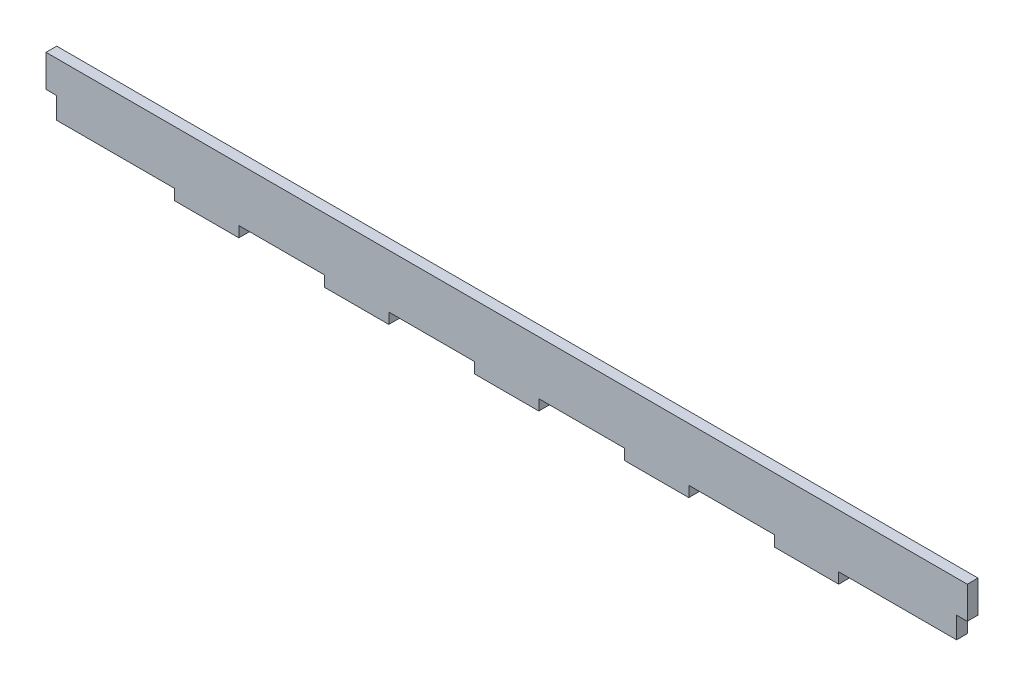
ISO-10303-21;
HEADER;
FILE_DESCRIPTION(('STEP AP214'),'2;1');
FILE_NAME('part.step','',(''),(''),'','','');
FILE_SCHEMA(('AUTOMOTIVE_DESIGN { 1 0 10303 214 1 1 1 1 }'));
ENDSEC;
DATA;
#1=APPLICATION_CONTEXT('core data for automotive mechanical design processes');
#2=APPLICATION_PROTOCOL_DEFINITION('international standard','automotive_design',2000,#1);
#3=PRODUCT_CONTEXT('',#1,'mechanical');
#4=PRODUCT('Part','Part','',(#3));
#5=PRODUCT_RELATED_PRODUCT_CATEGORY('part','',(#4));
#6=PRODUCT_DEFINITION_FORMATION('','',#4);
#7=PRODUCT_DEFINITION_CONTEXT('part definition',#1,'design');
#8=PRODUCT_DEFINITION('design','',#6,#7);
#9=PRODUCT_DEFINITION_SHAPE('','',#8);
#10=(LENGTH_UNIT() NAMED_UNIT(*) SI_UNIT(.MILLI.,.METRE.));
#11=(NAMED_UNIT(*) PLANE_ANGLE_UNIT() SI_UNIT($,.RADIAN.));
#12=(NAMED_UNIT(*) SI_UNIT($,.STERADIAN.) SOLID_ANGLE_UNIT());
#13=UNCERTAINTY_MEASURE_WITH_UNIT(LENGTH_MEASURE(1.E-05),#10,'distance_accuracy_value','');
#14=(GEOMETRIC_REPRESENTATION_CONTEXT(3) GLOBAL_UNCERTAINTY_ASSIGNED_CONTEXT((#13)) GLOBAL_UNIT_ASSIGNED_CONTEXT((#10,
#11,#12)) REPRESENTATION_CONTEXT('',''));
#15=CARTESIAN_POINT('',(0.,0.,0.));
#16=DIRECTION('',(0.,0.,1.));
#17=DIRECTION('',(1.,0.,0.));
#18=AXIS2_PLACEMENT_3D('',#15,#16,#17);
#19=CARTESIAN_POINT('',(-169.999999999999,-430.000000000006,5.));
#20=DIRECTION('',(0.,1.,0.));
#21=DIRECTION('',(-1.,0.,0.));
#22=AXIS2_PLACEMENT_3D('',#19,#20,#21);
#23=PLANE('',#22);
#24=DIRECTION('',(1.,0.,0.));
#25=VECTOR('',#24,1.);
#26=CARTESIAN_POINT('',(-169.999999999999,-430.000000000006,0.));
#27=LINE('',#26,#25);
#28=CARTESIAN_POINT('',(-209.999999999999,-430.000000000006,0.));
#29=VERTEX_POINT('',#28);
#30=CARTESIAN_POINT('',(-169.999999999999,-430.000000000006,0.));
#31=VERTEX_POINT('',#30);
#32=EDGE_CURVE('E264',#29,#31,#27,.T.);
#33=ORIENTED_EDGE('',*,*,#32,.T.);
#34=DIRECTION('',(0.,0.,-1.));
#35=VECTOR('',#34,1.);
#36=CARTESIAN_POINT('',(-169.999999999999,-430.000000000006,5.));
#37=LINE('',#36,#35);
#38=CARTESIAN_POINT('',(-169.999999999999,-430.000000000006,5.));
#39=VERTEX_POINT('',#38);
#40=EDGE_CURVE('E11',#39,#31,#37,.T.);
#41=ORIENTED_EDGE('',*,*,#40,.F.);
#42=DIRECTION('',(1.,0.,0.));
#43=VECTOR('',#42,1.);
#44=CARTESIAN_POINT('',(-169.999999999999,-430.000000000006,5.));
#45=LINE('',#44,#43);
#46=CARTESIAN_POINT('',(-209.999999999999,-430.000000000006,5.));
#47=VERTEX_POINT('',#46);
#48=EDGE_CURVE('E346',#47,#39,#45,.T.);
#49=ORIENTED_EDGE('',*,*,#48,.F.);
#50=DIRECTION('',(0.,0.,-1.));
#51=VECTOR('',#50,1.);
#52=CARTESIAN_POINT('',(-209.999999999999,-430.000000000006,5.));
#53=LINE('',#52,#51);
#54=EDGE_CURVE('E260',#47,#29,#53,.T.);
#55=ORIENTED_EDGE('',*,*,#54,.T.);
#56=EDGE_LOOP('',(#33,#41,#49,#55));
#57=FACE_BOUND('',#56,.T.);
#58=ADVANCED_FACE('F43',(#57),#23,.F.);
#59=CARTESIAN_POINT('',(-169.999999999999,-435.,5.));
#60=DIRECTION('',(1.,0.,0.));
#61=DIRECTION('',(0.,0.,-1.));
#62=AXIS2_PLACEMENT_3D('',#59,#60,#61);
#63=PLANE('',#62);
#64=DIRECTION('',(0.,-1.,0.));
#65=VECTOR('',#64,1.);
#66=CARTESIAN_POINT('',(-169.999999999999,-435.,0.));
#67=LINE('',#66,#65);
#68=CARTESIAN_POINT('',(-169.999999999999,-435.,0.));
#69=VERTEX_POINT('',#68);
#70=EDGE_CURVE('E268',#31,#69,#67,.T.);
#71=ORIENTED_EDGE('',*,*,#70,.T.);
#72=DIRECTION('',(0.,0.,-1.));
#73=VECTOR('',#72,1.);
#74=CARTESIAN_POINT('',(-169.999999999999,-435.,5.));
#75=LINE('',#74,#73);
#76=CARTESIAN_POINT('',(-169.999999999999,-435.,5.));
#77=VERTEX_POINT('',#76);
#78=EDGE_CURVE('E52',#77,#69,#75,.T.);
#79=ORIENTED_EDGE('',*,*,#78,.F.);
#80=DIRECTION('',(0.,-1.,0.));
#81=VECTOR('',#80,1.);
#82=CARTESIAN_POINT('',(-169.999999999999,-435.,5.));
#83=LINE('',#82,#81);
#84=EDGE_CURVE('E163',#39,#77,#83,.T.);
#85=ORIENTED_EDGE('',*,*,#84,.F.);
#86=ORIENTED_EDGE('',*,*,#40,.T.);
#87=EDGE_LOOP('',(#71,#79,#85,#86));
#88=FACE_BOUND('',#87,.T.);
#89=ADVANCED_FACE('F552',(#88),#63,.F.);
#90=CARTESIAN_POINT('',(-139.999999999999,-435.,5.));
#91=DIRECTION('',(0.,1.,0.));
#92=DIRECTION('',(-1.,0.,0.));
#93=AXIS2_PLACEMENT_3D('',#90,#91,#92);
#94=PLANE('',#93);
#95=DIRECTION('',(1.,0.,0.));
#96=VECTOR('',#95,1.);
#97=CARTESIAN_POINT('',(-139.999999999999,-435.,0.));
#98=LINE('',#97,#96);
#99=CARTESIAN_POINT('',(-139.999999999999,-435.,0.));
#100=VERTEX_POINT('',#99);
#101=EDGE_CURVE('E271',#69,#100,#98,.T.);
#102=ORIENTED_EDGE('',*,*,#101,.T.);
#103=DIRECTION('',(0.,0.,-1.));
#104=VECTOR('',#103,1.);
#105=CARTESIAN_POINT('',(-139.999999999999,-435.,5.));
#106=LINE('',#105,#104);
#107=CARTESIAN_POINT('',(-139.999999999999,-435.,5.));
#108=VERTEX_POINT('',#107);
#109=EDGE_CURVE('E437',#108,#100,#106,.T.);
#110=ORIENTED_EDGE('',*,*,#109,.F.);
#111=DIRECTION('',(1.,0.,0.));
#112=VECTOR('',#111,1.);
#113=CARTESIAN_POINT('',(-139.999999999999,-435.,5.));
#114=LINE('',#113,#112);
#115=EDGE_CURVE('E447',#77,#108,#114,.T.);
#116=ORIENTED_EDGE('',*,*,#115,.F.);
#117=ORIENTED_EDGE('',*,*,#78,.T.);
#118=EDGE_LOOP('',(#102,#110,#116,#117));
#119=FACE_BOUND('',#118,.T.);
#120=ADVANCED_FACE('F445',(#119),#94,.F.);
#121=CARTESIAN_POINT('',(-139.999999999999,-430.000000000006,5.));
#122=DIRECTION('',(-1.,0.,0.));
#123=DIRECTION('',(0.,0.,1.));
#124=AXIS2_PLACEMENT_3D('',#121,#122,#123);
#125=PLANE('',#124);
#126=DIRECTION('',(0.,1.,0.));
#127=VECTOR('',#126,1.);
#128=CARTESIAN_POINT('',(-139.999999999999,-430.000000000006,0.));
#129=LINE('',#128,#127);
#130=CARTESIAN_POINT('',(-139.999999999999,-430.000000000006,0.));
#131=VERTEX_POINT('',#130);
#132=EDGE_CURVE('E274',#100,#131,#129,.T.);
#133=ORIENTED_EDGE('',*,*,#132,.T.);
#134=DIRECTION('',(0.,0.,-1.));
#135=VECTOR('',#134,1.);
#136=CARTESIAN_POINT('',(-139.999999999999,-430.000000000006,5.));
#137=LINE('',#136,#135);
#138=CARTESIAN_POINT('',(-139.999999999999,-430.000000000006,5.));
#139=VERTEX_POINT('',#138);
#140=EDGE_CURVE('E433',#139,#131,#137,.T.);
#141=ORIENTED_EDGE('',*,*,#140,.F.);
#142=DIRECTION('',(0.,1.,0.));
#143=VECTOR('',#142,1.);
#144=CARTESIAN_POINT('',(-139.999999999999,-430.000000000006,5.));
#145=LINE('',#144,#143);
#146=EDGE_CURVE('E466',#108,#139,#145,.T.);
#147=ORIENTED_EDGE('',*,*,#146,.F.);
#148=ORIENTED_EDGE('',*,*,#109,.T.);
#149=EDGE_LOOP('',(#133,#141,#147,#148));
#150=FACE_BOUND('',#149,.T.);
#151=ADVANCED_FACE('F456',(#150),#125,.F.);
#152=CARTESIAN_POINT('',(-99.9999999999994,-430.000000000006,5.));
#153=DIRECTION('',(0.,1.,0.));
#154=DIRECTION('',(-1.,0.,0.));
#155=AXIS2_PLACEMENT_3D('',#152,#153,#154);
#156=PLANE('',#155);
#157=DIRECTION('',(1.,0.,0.));
#158=VECTOR('',#157,1.);
#159=CARTESIAN_POINT('',(-99.9999999999994,-430.000000000006,0.));
#160=LINE('',#159,#158);
#161=CARTESIAN_POINT('',(-99.9999999999994,-430.000000000006,0.));
#162=VERTEX_POINT('',#161);
#163=EDGE_CURVE('E277',#131,#162,#160,.T.);
#164=ORIENTED_EDGE('',*,*,#163,.T.);
#165=DIRECTION('',(0.,0.,-1.));
#166=VECTOR('',#165,1.);
#167=CARTESIAN_POINT('',(-99.9999999999994,-430.000000000006,5.));
#168=LINE('',#167,#166);
#169=CARTESIAN_POINT('',(-99.9999999999994,-430.000000000006,5.));
#170=VERTEX_POINT('',#169);
#171=EDGE_CURVE('E429',#170,#162,#168,.T.);
#172=ORIENTED_EDGE('',*,*,#171,.F.);
#173=DIRECTION('',(1.,0.,0.));
#174=VECTOR('',#173,1.);
#175=CARTESIAN_POINT('',(-99.9999999999994,-430.000000000006,5.));
#176=LINE('',#175,#174);
#177=EDGE_CURVE('E462',#139,#170,#176,.T.);
#178=ORIENTED_EDGE('',*,*,#177,.F.);
#179=ORIENTED_EDGE('',*,*,#140,.T.);
#180=EDGE_LOOP('',(#164,#172,#178,#179));
#181=FACE_BOUND('',#180,.T.);
#182=ADVANCED_FACE('F460',(#181),#156,.F.);
#183=CARTESIAN_POINT('',(-99.9999999999994,-435.,5.));
#184=DIRECTION('',(1.,0.,0.));
#185=DIRECTION('',(0.,0.,-1.));
#186=AXIS2_PLACEMENT_3D('',#183,#184,#185);
#187=PLANE('',#186);
#188=DIRECTION('',(0.,-1.,0.));
#189=VECTOR('',#188,1.);
#190=CARTESIAN_POINT('',(-99.9999999999994,-435.,0.));
#191=LINE('',#190,#189);
#192=CARTESIAN_POINT('',(-99.9999999999994,-435.,0.));
#193=VERTEX_POINT('',#192);
#194=EDGE_CURVE('E280',#162,#193,#191,.T.);
#195=ORIENTED_EDGE('',*,*,#194,.T.);
#196=DIRECTION('',(0.,0.,-1.));
#197=VECTOR('',#196,1.);
#198=CARTESIAN_POINT('',(-99.9999999999994,-435.,5.));
#199=LINE('',#198,#197);
#200=CARTESIAN_POINT('',(-99.9999999999994,-435.,5.));
#201=VERTEX_POINT('',#200);
#202=EDGE_CURVE('E425',#201,#193,#199,.T.);
#203=ORIENTED_EDGE('',*,*,#202,.F.);
#204=DIRECTION('',(0.,-1.,0.));
#205=VECTOR('',#204,1.);
#206=CARTESIAN_POINT('',(-99.9999999999994,-435.,5.));
#207=LINE('',#206,#205);
#208=EDGE_CURVE('E465',#170,#201,#207,.T.);
#209=ORIENTED_EDGE('',*,*,#208,.F.);
#210=ORIENTED_EDGE('',*,*,#171,.T.);
#211=EDGE_LOOP('',(#195,#203,#209,#210));
#212=FACE_BOUND('',#211,.T.);
#213=ADVANCED_FACE('F565',(#212),#187,.F.);
#214=CARTESIAN_POINT('',(-69.9999999999994,-435.,5.));
#215=DIRECTION('',(0.,1.,0.));
#216=DIRECTION('',(-1.,0.,0.));
#217=AXIS2_PLACEMENT_3D('',#214,#215,#216);
#218=PLANE('',#217);
#219=DIRECTION('',(1.,0.,0.));
#220=VECTOR('',#219,1.);
#221=CARTESIAN_POINT('',(-69.9999999999994,-435.,0.));
#222=LINE('',#221,#220);
#223=CARTESIAN_POINT('',(-69.9999999999994,-435.,0.));
#224=VERTEX_POINT('',#223);
#225=EDGE_CURVE('E283',#193,#224,#222,.T.);
#226=ORIENTED_EDGE('',*,*,#225,.T.);
#227=DIRECTION('',(0.,0.,-1.));
#228=VECTOR('',#227,1.);
#229=CARTESIAN_POINT('',(-69.9999999999994,-435.,5.));
#230=LINE('',#229,#228);
#231=CARTESIAN_POINT('',(-69.9999999999994,-435.,5.));
#232=VERTEX_POINT('',#231);
#233=EDGE_CURVE('E421',#232,#224,#230,.T.);
#234=ORIENTED_EDGE('',*,*,#233,.F.);
#235=DIRECTION('',(1.,0.,0.));
#236=VECTOR('',#235,1.);
#237=CARTESIAN_POINT('',(-69.9999999999994,-435.,5.));
#238=LINE('',#237,#236);
#239=EDGE_CURVE('E470',#201,#232,#238,.T.);
#240=ORIENTED_EDGE('',*,*,#239,.F.);
#241=ORIENTED_EDGE('',*,*,#202,.T.);
#242=EDGE_LOOP('',(#226,#234,#240,#241));
#243=FACE_BOUND('',#242,.T.);
#244=ADVANCED_FACE('F568',(#243),#218,.F.);
#245=CARTESIAN_POINT('',(-69.9999999999994,-430.000000000006,5.));
#246=DIRECTION('',(-1.,0.,0.));
#247=DIRECTION('',(0.,0.,1.));
#248=AXIS2_PLACEMENT_3D('',#245,#246,#247);
#249=PLANE('',#248);
#250=DIRECTION('',(0.,1.,0.));
#251=VECTOR('',#250,1.);
#252=CARTESIAN_POINT('',(-69.9999999999994,-430.000000000006,0.));
#253=LINE('',#252,#251);
#254=CARTESIAN_POINT('',(-69.9999999999994,-430.000000000006,0.));
#255=VERTEX_POINT('',#254);
#256=EDGE_CURVE('E286',#224,#255,#253,.T.);
#257=ORIENTED_EDGE('',*,*,#256,.T.);
#258=DIRECTION('',(0.,0.,-1.));
#259=VECTOR('',#258,1.);
#260=CARTESIAN_POINT('',(-69.9999999999994,-430.000000000006,5.));
#261=LINE('',#260,#259);
#262=CARTESIAN_POINT('',(-69.9999999999994,-430.000000000006,5.));
#263=VERTEX_POINT('',#262);
#264=EDGE_CURVE('E417',#263,#255,#261,.T.);
#265=ORIENTED_EDGE('',*,*,#264,.F.);
#266=DIRECTION('',(0.,1.,0.));
#267=VECTOR('',#266,1.);
#268=CARTESIAN_POINT('',(-69.9999999999994,-430.000000000006,5.));
#269=LINE('',#268,#267);
#270=EDGE_CURVE('E477',#232,#263,#269,.T.);
#271=ORIENTED_EDGE('',*,*,#270,.F.);
#272=ORIENTED_EDGE('',*,*,#233,.T.);
#273=EDGE_LOOP('',(#257,#265,#271,#272));
#274=FACE_BOUND('',#273,.T.);
#275=ADVANCED_FACE('F572',(#274),#249,.F.);
#276=CARTESIAN_POINT('',(-15.000000000053,-430.000000000006,5.));
#277=DIRECTION('',(0.,1.,0.));
#278=DIRECTION('',(0.,0.,1.));
#279=AXIS2_PLACEMENT_3D('',#276,#277,#278);
#280=PLANE('',#279);
#281=DIRECTION('',(1.,0.,0.));
#282=VECTOR('',#281,1.);
#283=CARTESIAN_POINT('',(-15.000000000053,-430.000000000006,0.));
#284=LINE('',#283,#282);
#285=CARTESIAN_POINT('',(-15.000000000053,-430.000000000006,0.));
#286=VERTEX_POINT('',#285);
#287=EDGE_CURVE('E289',#255,#286,#284,.T.);
#288=ORIENTED_EDGE('',*,*,#287,.T.);
#289=DIRECTION('',(0.,0.,-1.));
#290=VECTOR('',#289,1.);
#291=CARTESIAN_POINT('',(-15.000000000053,-430.000000000006,5.));
#292=LINE('',#291,#290);
#293=CARTESIAN_POINT('',(-15.000000000053,-430.000000000006,5.));
#294=VERTEX_POINT('',#293);
#295=EDGE_CURVE('E413',#294,#286,#292,.T.);
#296=ORIENTED_EDGE('',*,*,#295,.F.);
#297=DIRECTION('',(1.,0.,0.));
#298=VECTOR('',#297,1.);
#299=CARTESIAN_POINT('',(-15.000000000053,-430.000000000006,5.));
#300=LINE('',#299,#298);
#301=EDGE_CURVE('E480',#263,#294,#300,.T.);
#302=ORIENTED_EDGE('',*,*,#301,.F.);
#303=ORIENTED_EDGE('',*,*,#264,.T.);
#304=EDGE_LOOP('',(#288,#296,#302,#303));
#305=FACE_BOUND('',#304,.T.);
#306=ADVANCED_FACE('F576',(#305),#280,.F.);
#307=CARTESIAN_POINT('',(-15.000000000053,-420.,5.));
#308=DIRECTION('',(-1.,0.,0.));
#309=DIRECTION('',(0.,0.,1.));
#310=AXIS2_PLACEMENT_3D('',#307,#308,#309);
#311=PLANE('',#310);
#312=DIRECTION('',(0.,1.,0.));
#313=VECTOR('',#312,1.);
#314=CARTESIAN_POINT('',(-15.000000000053,-420.,0.));
#315=LINE('',#314,#313);
#316=CARTESIAN_POINT('',(-15.000000000053,-420.,0.));
#317=VERTEX_POINT('',#316);
#318=EDGE_CURVE('E292',#286,#317,#315,.T.);
#319=ORIENTED_EDGE('',*,*,#318,.T.);
#320=DIRECTION('',(0.,0.,-1.));
#321=VECTOR('',#320,1.);
#322=CARTESIAN_POINT('',(-15.000000000053,-420.,5.));
#323=LINE('',#322,#321);
#324=CARTESIAN_POINT('',(-15.000000000053,-420.,5.));
#325=VERTEX_POINT('',#324);
#326=EDGE_CURVE('E409',#325,#317,#323,.T.);
#327=ORIENTED_EDGE('',*,*,#326,.F.);
#328=DIRECTION('',(0.,1.,0.));
#329=VECTOR('',#328,1.);
#330=CARTESIAN_POINT('',(-15.000000000053,-420.,5.));
#331=LINE('',#330,#329);
#332=EDGE_CURVE('E483',#294,#325,#331,.T.);
#333=ORIENTED_EDGE('',*,*,#332,.F.);
#334=ORIENTED_EDGE('',*,*,#295,.T.);
#335=EDGE_LOOP('',(#319,#327,#333,#334));
#336=FACE_BOUND('',#335,.T.);
#337=ADVANCED_FACE('F580',(#336),#311,.F.);
#338=CARTESIAN_POINT('',(-10.000000000053,-420.,5.));
#339=DIRECTION('',(0.,1.,0.));
#340=DIRECTION('',(0.,0.,1.));
#341=AXIS2_PLACEMENT_3D('',#338,#339,#340);
#342=PLANE('',#341);
#343=DIRECTION('',(1.,0.,0.));
#344=VECTOR('',#343,1.);
#345=CARTESIAN_POINT('',(-10.000000000053,-420.,0.));
#346=LINE('',#345,#344);
#347=CARTESIAN_POINT('',(-10.000000000053,-420.,0.));
#348=VERTEX_POINT('',#347);
#349=EDGE_CURVE('E295',#317,#348,#346,.T.);
#350=ORIENTED_EDGE('',*,*,#349,.T.);
#351=DIRECTION('',(0.,0.,-1.));
#352=VECTOR('',#351,1.);
#353=CARTESIAN_POINT('',(-10.000000000053,-420.,5.));
#354=LINE('',#353,#352);
#355=CARTESIAN_POINT('',(-10.000000000053,-420.,5.));
#356=VERTEX_POINT('',#355);
#357=EDGE_CURVE('E405',#356,#348,#354,.T.);
#358=ORIENTED_EDGE('',*,*,#357,.F.);
#359=DIRECTION('',(1.,0.,0.));
#360=VECTOR('',#359,1.);
#361=CARTESIAN_POINT('',(-10.000000000053,-420.,5.));
#362=LINE('',#361,#360);
#363=EDGE_CURVE('E486',#325,#356,#362,.T.);
#364=ORIENTED_EDGE('',*,*,#363,.F.);
#365=ORIENTED_EDGE('',*,*,#326,.T.);
#366=EDGE_LOOP('',(#350,#358,#364,#365));
#367=FACE_BOUND('',#366,.T.);
#368=ADVANCED_FACE('F584',(#367),#342,.F.);
#369=CARTESIAN_POINT('',(-10.000000000053,-405.,5.));
#370=DIRECTION('',(-1.,0.,0.));
#371=DIRECTION('',(0.,0.,1.));
#372=AXIS2_PLACEMENT_3D('',#369,#370,#371);
#373=PLANE('',#372);
#374=DIRECTION('',(0.,1.,0.));
#375=VECTOR('',#374,1.);
#376=CARTESIAN_POINT('',(-10.000000000053,-405.,0.));
#377=LINE('',#376,#375);
#378=CARTESIAN_POINT('',(-10.000000000053,-405.,0.));
#379=VERTEX_POINT('',#378);
#380=EDGE_CURVE('E298',#348,#379,#377,.T.);
#381=ORIENTED_EDGE('',*,*,#380,.T.);
#382=DIRECTION('',(0.,0.,-1.));
#383=VECTOR('',#382,1.);
#384=CARTESIAN_POINT('',(-10.000000000053,-405.,5.));
#385=LINE('',#384,#383);
#386=CARTESIAN_POINT('',(-10.000000000053,-405.,5.));
#387=VERTEX_POINT('',#386);
#388=EDGE_CURVE('E401',#387,#379,#385,.T.);
#389=ORIENTED_EDGE('',*,*,#388,.F.);
#390=DIRECTION('',(0.,1.,0.));
#391=VECTOR('',#390,1.);
#392=CARTESIAN_POINT('',(-10.000000000053,-405.,5.));
#393=LINE('',#392,#391);
#394=EDGE_CURVE('E489',#356,#387,#393,.T.);
#395=ORIENTED_EDGE('',*,*,#394,.F.);
#396=ORIENTED_EDGE('',*,*,#357,.T.);
#397=EDGE_LOOP('',(#381,#389,#395,#396));
#398=FACE_BOUND('',#397,.T.);
#399=ADVANCED_FACE('F588',(#398),#373,.F.);
#400=CARTESIAN_POINT('',(-439.999999999946,-405.,5.));
#401=DIRECTION('',(0.,-1.,0.));
#402=DIRECTION('',(0.,0.,-1.));
#403=AXIS2_PLACEMENT_3D('',#400,#401,#402);
#404=PLANE('',#403);
#405=DIRECTION('',(-1.,0.,0.));
#406=VECTOR('',#405,1.);
#407=CARTESIAN_POINT('',(-439.999999999946,-405.,0.));
#408=LINE('',#407,#406);
#409=CARTESIAN_POINT('',(-439.999999999946,-405.,0.));
#410=VERTEX_POINT('',#409);
#411=EDGE_CURVE('E301',#379,#410,#408,.T.);
#412=ORIENTED_EDGE('',*,*,#411,.T.);
#413=DIRECTION('',(0.,0.,-1.));
#414=VECTOR('',#413,1.);
#415=CARTESIAN_POINT('',(-439.999999999946,-405.,5.));
#416=LINE('',#415,#414);
#417=CARTESIAN_POINT('',(-439.999999999946,-405.,5.));
#418=VERTEX_POINT('',#417);
#419=EDGE_CURVE('E397',#418,#410,#416,.T.);
#420=ORIENTED_EDGE('',*,*,#419,.F.);
#421=DIRECTION('',(-1.,0.,0.));
#422=VECTOR('',#421,1.);
#423=CARTESIAN_POINT('',(-439.999999999946,-405.,5.));
#424=LINE('',#423,#422);
#425=EDGE_CURVE('E492',#387,#418,#424,.T.);
#426=ORIENTED_EDGE('',*,*,#425,.F.);
#427=ORIENTED_EDGE('',*,*,#388,.T.);
#428=EDGE_LOOP('',(#412,#420,#426,#427));
#429=FACE_BOUND('',#428,.T.);
#430=ADVANCED_FACE('F592',(#429),#404,.F.);
#431=CARTESIAN_POINT('',(-439.999999999946,-405.,5.));
#432=DIRECTION('',(1.,0.,0.));
#433=DIRECTION('',(0.,0.,-1.));
#434=AXIS2_PLACEMENT_3D('',#431,#432,#433);
#435=PLANE('',#434);
#436=DIRECTION('',(0.,-1.,0.));
#437=VECTOR('',#436,1.);
#438=CARTESIAN_POINT('',(-439.999999999946,-405.,0.));
#439=LINE('',#438,#437);
#440=CARTESIAN_POINT('',(-439.999999999946,-420.,0.));
#441=VERTEX_POINT('',#440);
#442=EDGE_CURVE('E304',#410,#441,#439,.T.);
#443=ORIENTED_EDGE('',*,*,#442,.T.);
#444=DIRECTION('',(0.,0.,-1.));
#445=VECTOR('',#444,1.);
#446=CARTESIAN_POINT('',(-439.999999999946,-420.,5.));
#447=LINE('',#446,#445);
#448=CARTESIAN_POINT('',(-439.999999999946,-420.,5.));
#449=VERTEX_POINT('',#448);
#450=EDGE_CURVE('E393',#449,#441,#447,.T.);
#451=ORIENTED_EDGE('',*,*,#450,.F.);
#452=DIRECTION('',(0.,-1.,0.));
#453=VECTOR('',#452,1.);
#454=CARTESIAN_POINT('',(-439.999999999946,-405.,5.));
#455=LINE('',#454,#453);
#456=EDGE_CURVE('E495',#418,#449,#455,.T.);
#457=ORIENTED_EDGE('',*,*,#456,.F.);
#458=ORIENTED_EDGE('',*,*,#419,.T.);
#459=EDGE_LOOP('',(#443,#451,#457,#458));
#460=FACE_BOUND('',#459,.T.);
#461=ADVANCED_FACE('F596',(#460),#435,.F.);
#462=CARTESIAN_POINT('',(-439.999999999946,-420.,5.));
#463=DIRECTION('',(0.,1.,0.));
#464=DIRECTION('',(0.,0.,1.));
#465=AXIS2_PLACEMENT_3D('',#462,#463,#464);
#466=PLANE('',#465);
#467=DIRECTION('',(1.,0.,0.));
#468=VECTOR('',#467,1.);
#469=CARTESIAN_POINT('',(-439.999999999946,-420.,0.));
#470=LINE('',#469,#468);
#471=CARTESIAN_POINT('',(-434.999999999946,-420.,0.));
#472=VERTEX_POINT('',#471);
#473=EDGE_CURVE('E307',#441,#472,#470,.T.);
#474=ORIENTED_EDGE('',*,*,#473,.T.);
#475=DIRECTION('',(0.,0.,-1.));
#476=VECTOR('',#475,1.);
#477=CARTESIAN_POINT('',(-434.999999999946,-420.,5.));
#478=LINE('',#477,#476);
#479=CARTESIAN_POINT('',(-434.999999999946,-420.,5.));
#480=VERTEX_POINT('',#479);
#481=EDGE_CURVE('E389',#480,#472,#478,.T.);
#482=ORIENTED_EDGE('',*,*,#481,.F.);
#483=DIRECTION('',(1.,0.,0.));
#484=VECTOR('',#483,1.);
#485=CARTESIAN_POINT('',(-439.999999999946,-420.,5.));
#486=LINE('',#485,#484);
#487=EDGE_CURVE('E498',#449,#480,#486,.T.);
#488=ORIENTED_EDGE('',*,*,#487,.F.);
#489=ORIENTED_EDGE('',*,*,#450,.T.);
#490=EDGE_LOOP('',(#474,#482,#488,#489));
#491=FACE_BOUND('',#490,.T.);
#492=ADVANCED_FACE('F600',(#491),#466,.F.);
#493=CARTESIAN_POINT('',(-434.999999999946,-420.,5.));
#494=DIRECTION('',(1.,0.,0.));
#495=DIRECTION('',(0.,0.,-1.));
#496=AXIS2_PLACEMENT_3D('',#493,#494,#495);
#497=PLANE('',#496);
#498=DIRECTION('',(0.,-1.,0.));
#499=VECTOR('',#498,1.);
#500=CARTESIAN_POINT('',(-434.999999999946,-420.,0.));
#501=LINE('',#500,#499);
#502=CARTESIAN_POINT('',(-434.999999999946,-430.000000000006,0.));
#503=VERTEX_POINT('',#502);
#504=EDGE_CURVE('E310',#472,#503,#501,.T.);
#505=ORIENTED_EDGE('',*,*,#504,.T.);
#506=DIRECTION('',(0.,0.,-1.));
#507=VECTOR('',#506,1.);
#508=CARTESIAN_POINT('',(-434.999999999946,-430.000000000006,5.));
#509=LINE('',#508,#507);
#510=CARTESIAN_POINT('',(-434.999999999946,-430.000000000006,5.));
#511=VERTEX_POINT('',#510);
#512=EDGE_CURVE('E385',#511,#503,#509,.T.);
#513=ORIENTED_EDGE('',*,*,#512,.F.);
#514=DIRECTION('',(0.,-1.,0.));
#515=VECTOR('',#514,1.);
#516=CARTESIAN_POINT('',(-434.999999999946,-420.,5.));
#517=LINE('',#516,#515);
#518=EDGE_CURVE('E501',#480,#511,#517,.T.);
#519=ORIENTED_EDGE('',*,*,#518,.F.);
#520=ORIENTED_EDGE('',*,*,#481,.T.);
#521=EDGE_LOOP('',(#505,#513,#519,#520));
#522=FACE_BOUND('',#521,.T.);
#523=ADVANCED_FACE('F604',(#522),#497,.F.);
#524=CARTESIAN_POINT('',(-434.999999999946,-430.000000000006,5.));
#525=DIRECTION('',(0.,1.,0.));
#526=DIRECTION('',(0.,0.,1.));
#527=AXIS2_PLACEMENT_3D('',#524,#525,#526);
#528=PLANE('',#527);
#529=DIRECTION('',(1.,0.,0.));
#530=VECTOR('',#529,1.);
#531=CARTESIAN_POINT('',(-434.999999999946,-430.000000000006,0.));
#532=LINE('',#531,#530);
#533=CARTESIAN_POINT('',(-379.999999999999,-430.000000000006,0.));
#534=VERTEX_POINT('',#533);
#535=EDGE_CURVE('E313',#503,#534,#532,.T.);
#536=ORIENTED_EDGE('',*,*,#535,.T.);
#537=DIRECTION('',(0.,0.,-1.));
#538=VECTOR('',#537,1.);
#539=CARTESIAN_POINT('',(-379.999999999999,-430.000000000006,5.));
#540=LINE('',#539,#538);
#541=CARTESIAN_POINT('',(-379.999999999999,-430.000000000006,5.));
#542=VERTEX_POINT('',#541);
#543=EDGE_CURVE('E381',#542,#534,#540,.T.);
#544=ORIENTED_EDGE('',*,*,#543,.F.);
#545=DIRECTION('',(1.,0.,0.));
#546=VECTOR('',#545,1.);
#547=CARTESIAN_POINT('',(-434.999999999946,-430.000000000006,5.));
#548=LINE('',#547,#546);
#549=EDGE_CURVE('E504',#511,#542,#548,.T.);
#550=ORIENTED_EDGE('',*,*,#549,.F.);
#551=ORIENTED_EDGE('',*,*,#512,.T.);
#552=EDGE_LOOP('',(#536,#544,#550,#551));
#553=FACE_BOUND('',#552,.T.);
#554=ADVANCED_FACE('F608',(#553),#528,.F.);
#555=CARTESIAN_POINT('',(-379.999999999999,-430.000000000006,5.));
#556=DIRECTION('',(1.,0.,0.));
#557=DIRECTION('',(0.,0.,-1.));
#558=AXIS2_PLACEMENT_3D('',#555,#556,#557);
#559=PLANE('',#558);
#560=DIRECTION('',(0.,-1.,0.));
#561=VECTOR('',#560,1.);
#562=CARTESIAN_POINT('',(-379.999999999999,-430.000000000006,0.));
#563=LINE('',#562,#561);
#564=CARTESIAN_POINT('',(-379.999999999999,-435.,0.));
#565=VERTEX_POINT('',#564);
#566=EDGE_CURVE('E316',#534,#565,#563,.T.);
#567=ORIENTED_EDGE('',*,*,#566,.T.);
#568=DIRECTION('',(0.,0.,-1.));
#569=VECTOR('',#568,1.);
#570=CARTESIAN_POINT('',(-379.999999999999,-435.,5.));
#571=LINE('',#570,#569);
#572=CARTESIAN_POINT('',(-379.999999999999,-435.,5.));
#573=VERTEX_POINT('',#572);
#574=EDGE_CURVE('E377',#573,#565,#571,.T.);
#575=ORIENTED_EDGE('',*,*,#574,.F.);
#576=DIRECTION('',(0.,-1.,0.));
#577=VECTOR('',#576,1.);
#578=CARTESIAN_POINT('',(-379.999999999999,-430.000000000006,5.));
#579=LINE('',#578,#577);
#580=EDGE_CURVE('E507',#542,#573,#579,.T.);
#581=ORIENTED_EDGE('',*,*,#580,.F.);
#582=ORIENTED_EDGE('',*,*,#543,.T.);
#583=EDGE_LOOP('',(#567,#575,#581,#582));
#584=FACE_BOUND('',#583,.T.);
#585=ADVANCED_FACE('F612',(#584),#559,.F.);
#586=CARTESIAN_POINT('',(-379.999999999999,-435.,5.));
#587=DIRECTION('',(0.,1.,0.));
#588=DIRECTION('',(-1.,0.,0.));
#589=AXIS2_PLACEMENT_3D('',#586,#587,#588);
#590=PLANE('',#589);
#591=DIRECTION('',(1.,0.,0.));
#592=VECTOR('',#591,1.);
#593=CARTESIAN_POINT('',(-379.999999999999,-435.,0.));
#594=LINE('',#593,#592);
#595=CARTESIAN_POINT('',(-350.,-435.,0.));
#596=VERTEX_POINT('',#595);
#597=EDGE_CURVE('E319',#565,#596,#594,.T.);
#598=ORIENTED_EDGE('',*,*,#597,.T.);
#599=DIRECTION('',(0.,0.,-1.));
#600=VECTOR('',#599,1.);
#601=CARTESIAN_POINT('',(-350.,-435.,5.));
#602=LINE('',#601,#600);
#603=CARTESIAN_POINT('',(-350.,-435.,5.));
#604=VERTEX_POINT('',#603);
#605=EDGE_CURVE('E373',#604,#596,#602,.T.);
#606=ORIENTED_EDGE('',*,*,#605,.F.);
#607=DIRECTION('',(1.,0.,0.));
#608=VECTOR('',#607,1.);
#609=CARTESIAN_POINT('',(-379.999999999999,-435.,5.));
#610=LINE('',#609,#608);
#611=EDGE_CURVE('E510',#573,#604,#610,.T.);
#612=ORIENTED_EDGE('',*,*,#611,.F.);
#613=ORIENTED_EDGE('',*,*,#574,.T.);
#614=EDGE_LOOP('',(#598,#606,#612,#613));
#615=FACE_BOUND('',#614,.T.);
#616=ADVANCED_FACE('F616',(#615),#590,.F.);
#617=CARTESIAN_POINT('',(-350.,-435.,5.));
#618=DIRECTION('',(-1.,0.,0.));
#619=DIRECTION('',(0.,0.,1.));
#620=AXIS2_PLACEMENT_3D('',#617,#618,#619);
#621=PLANE('',#620);
#622=DIRECTION('',(0.,1.,0.));
#623=VECTOR('',#622,1.);
#624=CARTESIAN_POINT('',(-350.,-435.,0.));
#625=LINE('',#624,#623);
#626=CARTESIAN_POINT('',(-350.,-430.000000000006,0.));
#627=VERTEX_POINT('',#626);
#628=EDGE_CURVE('E322',#596,#627,#625,.T.);
#629=ORIENTED_EDGE('',*,*,#628,.T.);
#630=DIRECTION('',(0.,0.,-1.));
#631=VECTOR('',#630,1.);
#632=CARTESIAN_POINT('',(-350.,-430.000000000006,5.));
#633=LINE('',#632,#631);
#634=CARTESIAN_POINT('',(-350.,-430.000000000006,5.));
#635=VERTEX_POINT('',#634);
#636=EDGE_CURVE('E369',#635,#627,#633,.T.);
#637=ORIENTED_EDGE('',*,*,#636,.F.);
#638=DIRECTION('',(0.,1.,0.));
#639=VECTOR('',#638,1.);
#640=CARTESIAN_POINT('',(-350.,-435.,5.));
#641=LINE('',#640,#639);
#642=EDGE_CURVE('E513',#604,#635,#641,.T.);
#643=ORIENTED_EDGE('',*,*,#642,.F.);
#644=ORIENTED_EDGE('',*,*,#605,.T.);
#645=EDGE_LOOP('',(#629,#637,#643,#644));
#646=FACE_BOUND('',#645,.T.);
#647=ADVANCED_FACE('F620',(#646),#621,.F.);
#648=CARTESIAN_POINT('',(-350.,-430.000000000006,5.));
#649=DIRECTION('',(0.,1.,0.));
#650=DIRECTION('',(-1.,0.,0.));
#651=AXIS2_PLACEMENT_3D('',#648,#649,#650);
#652=PLANE('',#651);
#653=DIRECTION('',(1.,0.,0.));
#654=VECTOR('',#653,1.);
#655=CARTESIAN_POINT('',(-350.,-430.000000000006,0.));
#656=LINE('',#655,#654);
#657=CARTESIAN_POINT('',(-310.,-430.000000000006,0.));
#658=VERTEX_POINT('',#657);
#659=EDGE_CURVE('E325',#627,#658,#656,.T.);
#660=ORIENTED_EDGE('',*,*,#659,.T.);
#661=DIRECTION('',(0.,0.,-1.));
#662=VECTOR('',#661,1.);
#663=CARTESIAN_POINT('',(-310.,-430.000000000006,5.));
#664=LINE('',#663,#662);
#665=CARTESIAN_POINT('',(-310.,-430.000000000006,5.));
#666=VERTEX_POINT('',#665);
#667=EDGE_CURVE('E365',#666,#658,#664,.T.);
#668=ORIENTED_EDGE('',*,*,#667,.F.);
#669=DIRECTION('',(1.,0.,0.));
#670=VECTOR('',#669,1.);
#671=CARTESIAN_POINT('',(-350.,-430.000000000006,5.));
#672=LINE('',#671,#670);
#673=EDGE_CURVE('E516',#635,#666,#672,.T.);
#674=ORIENTED_EDGE('',*,*,#673,.F.);
#675=ORIENTED_EDGE('',*,*,#636,.T.);
#676=EDGE_LOOP('',(#660,#668,#674,#675));
#677=FACE_BOUND('',#676,.T.);
#678=ADVANCED_FACE('F624',(#677),#652,.F.);
#679=CARTESIAN_POINT('',(-310.,-430.000000000006,5.));
#680=DIRECTION('',(1.,0.,0.));
#681=DIRECTION('',(0.,0.,-1.));
#682=AXIS2_PLACEMENT_3D('',#679,#680,#681);
#683=PLANE('',#682);
#684=DIRECTION('',(0.,-1.,0.));
#685=VECTOR('',#684,1.);
#686=CARTESIAN_POINT('',(-310.,-430.000000000006,0.));
#687=LINE('',#686,#685);
#688=CARTESIAN_POINT('',(-310.,-435.,0.));
#689=VERTEX_POINT('',#688);
#690=EDGE_CURVE('E328',#658,#689,#687,.T.);
#691=ORIENTED_EDGE('',*,*,#690,.T.);
#692=DIRECTION('',(0.,0.,-1.));
#693=VECTOR('',#692,1.);
#694=CARTESIAN_POINT('',(-310.,-435.,5.));
#695=LINE('',#694,#693);
#696=CARTESIAN_POINT('',(-310.,-435.,5.));
#697=VERTEX_POINT('',#696);
#698=EDGE_CURVE('E361',#697,#689,#695,.T.);
#699=ORIENTED_EDGE('',*,*,#698,.F.);
#700=DIRECTION('',(0.,-1.,0.));
#701=VECTOR('',#700,1.);
#702=CARTESIAN_POINT('',(-310.,-430.000000000006,5.));
#703=LINE('',#702,#701);
#704=EDGE_CURVE('E519',#666,#697,#703,.T.);
#705=ORIENTED_EDGE('',*,*,#704,.F.);
#706=ORIENTED_EDGE('',*,*,#667,.T.);
#707=EDGE_LOOP('',(#691,#699,#705,#706));
#708=FACE_BOUND('',#707,.T.);
#709=ADVANCED_FACE('F628',(#708),#683,.F.);
#710=CARTESIAN_POINT('',(-310.,-435.,5.));
#711=DIRECTION('',(0.,1.,0.));
#712=DIRECTION('',(-1.,0.,0.));
#713=AXIS2_PLACEMENT_3D('',#710,#711,#712);
#714=PLANE('',#713);
#715=DIRECTION('',(1.,0.,0.));
#716=VECTOR('',#715,1.);
#717=CARTESIAN_POINT('',(-310.,-435.,0.));
#718=LINE('',#717,#716);
#719=CARTESIAN_POINT('',(-280.,-435.,0.));
#720=VERTEX_POINT('',#719);
#721=EDGE_CURVE('E331',#689,#720,#718,.T.);
#722=ORIENTED_EDGE('',*,*,#721,.T.);
#723=DIRECTION('',(0.,0.,-1.));
#724=VECTOR('',#723,1.);
#725=CARTESIAN_POINT('',(-280.,-435.,5.));
#726=LINE('',#725,#724);
#727=CARTESIAN_POINT('',(-280.,-435.,5.));
#728=VERTEX_POINT('',#727);
#729=EDGE_CURVE('E357',#728,#720,#726,.T.);
#730=ORIENTED_EDGE('',*,*,#729,.F.);
#731=DIRECTION('',(1.,0.,0.));
#732=VECTOR('',#731,1.);
#733=CARTESIAN_POINT('',(-310.,-435.,5.));
#734=LINE('',#733,#732);
#735=EDGE_CURVE('E522',#697,#728,#734,.T.);
#736=ORIENTED_EDGE('',*,*,#735,.F.);
#737=ORIENTED_EDGE('',*,*,#698,.T.);
#738=EDGE_LOOP('',(#722,#730,#736,#737));
#739=FACE_BOUND('',#738,.T.);
#740=ADVANCED_FACE('F632',(#739),#714,.F.);
#741=CARTESIAN_POINT('',(-280.,-435.,5.));
#742=DIRECTION('',(-1.,0.,0.));
#743=DIRECTION('',(0.,0.,1.));
#744=AXIS2_PLACEMENT_3D('',#741,#742,#743);
#745=PLANE('',#744);
#746=DIRECTION('',(0.,1.,0.));
#747=VECTOR('',#746,1.);
#748=CARTESIAN_POINT('',(-280.,-435.,0.));
#749=LINE('',#748,#747);
#750=CARTESIAN_POINT('',(-280.,-430.000000000006,0.));
#751=VERTEX_POINT('',#750);
#752=EDGE_CURVE('E334',#720,#751,#749,.T.);
#753=ORIENTED_EDGE('',*,*,#752,.T.);
#754=DIRECTION('',(0.,0.,-1.));
#755=VECTOR('',#754,1.);
#756=CARTESIAN_POINT('',(-280.,-430.000000000006,5.));
#757=LINE('',#756,#755);
#758=CARTESIAN_POINT('',(-280.,-430.000000000006,5.));
#759=VERTEX_POINT('',#758);
#760=EDGE_CURVE('E353',#759,#751,#757,.T.);
#761=ORIENTED_EDGE('',*,*,#760,.F.);
#762=DIRECTION('',(0.,1.,0.));
#763=VECTOR('',#762,1.);
#764=CARTESIAN_POINT('',(-280.,-435.,5.));
#765=LINE('',#764,#763);
#766=EDGE_CURVE('E525',#728,#759,#765,.T.);
#767=ORIENTED_EDGE('',*,*,#766,.F.);
#768=ORIENTED_EDGE('',*,*,#729,.T.);
#769=EDGE_LOOP('',(#753,#761,#767,#768));
#770=FACE_BOUND('',#769,.T.);
#771=ADVANCED_FACE('F533',(#770),#745,.F.);
#772=CARTESIAN_POINT('',(-280.,-430.000000000006,5.));
#773=DIRECTION('',(0.,1.,0.));
#774=DIRECTION('',(-1.,0.,0.));
#775=AXIS2_PLACEMENT_3D('',#772,#773,#774);
#776=PLANE('',#775);
#777=DIRECTION('',(1.,0.,0.));
#778=VECTOR('',#777,1.);
#779=CARTESIAN_POINT('',(-280.,-430.000000000006,0.));
#780=LINE('',#779,#778);
#781=CARTESIAN_POINT('',(-239.999999999999,-430.000000000006,0.));
#782=VERTEX_POINT('',#781);
#783=EDGE_CURVE('E337',#751,#782,#780,.T.);
#784=ORIENTED_EDGE('',*,*,#783,.T.);
#785=DIRECTION('',(0.,0.,-1.));
#786=VECTOR('',#785,1.);
#787=CARTESIAN_POINT('',(-239.999999999999,-430.000000000006,5.));
#788=LINE('',#787,#786);
#789=CARTESIAN_POINT('',(-239.999999999999,-430.000000000006,5.));
#790=VERTEX_POINT('',#789);
#791=EDGE_CURVE('E253',#790,#782,#788,.T.);
#792=ORIENTED_EDGE('',*,*,#791,.F.);
#793=DIRECTION('',(1.,0.,0.));
#794=VECTOR('',#793,1.);
#795=CARTESIAN_POINT('',(-280.,-430.000000000006,5.));
#796=LINE('',#795,#794);
#797=EDGE_CURVE('E242',#759,#790,#796,.T.);
#798=ORIENTED_EDGE('',*,*,#797,.F.);
#799=ORIENTED_EDGE('',*,*,#760,.T.);
#800=EDGE_LOOP('',(#784,#792,#798,#799));
#801=FACE_BOUND('',#800,.T.);
#802=ADVANCED_FACE('F537',(#801),#776,.F.);
#803=CARTESIAN_POINT('',(-239.999999999999,-430.000000000006,5.));
#804=DIRECTION('',(1.,0.,0.));
#805=DIRECTION('',(0.,0.,-1.));
#806=AXIS2_PLACEMENT_3D('',#803,#804,#805);
#807=PLANE('',#806);
#808=DIRECTION('',(0.,-1.,0.));
#809=VECTOR('',#808,1.);
#810=CARTESIAN_POINT('',(-239.999999999999,-430.000000000006,0.));
#811=LINE('',#810,#809);
#812=CARTESIAN_POINT('',(-239.999999999999,-435.,0.));
#813=VERTEX_POINT('',#812);
#814=EDGE_CURVE('E251',#782,#813,#811,.T.);
#815=ORIENTED_EDGE('',*,*,#814,.T.);
#816=DIRECTION('',(0.,0.,-1.));
#817=VECTOR('',#816,1.);
#818=CARTESIAN_POINT('',(-239.999999999999,-435.,5.));
#819=LINE('',#818,#817);
#820=CARTESIAN_POINT('',(-239.999999999999,-435.,5.));
#821=VERTEX_POINT('',#820);
#822=EDGE_CURVE('E248',#821,#813,#819,.T.);
#823=ORIENTED_EDGE('',*,*,#822,.F.);
#824=DIRECTION('',(0.,-1.,0.));
#825=VECTOR('',#824,1.);
#826=CARTESIAN_POINT('',(-239.999999999999,-430.000000000006,5.));
#827=LINE('',#826,#825);
#828=EDGE_CURVE('E236',#790,#821,#827,.T.);
#829=ORIENTED_EDGE('',*,*,#828,.F.);
#830=ORIENTED_EDGE('',*,*,#791,.T.);
#831=EDGE_LOOP('',(#815,#823,#829,#830));
#832=FACE_BOUND('',#831,.T.);
#833=ADVANCED_FACE('F249',(#832),#807,.F.);
#834=CARTESIAN_POINT('',(-239.999999999999,-435.,5.));
#835=DIRECTION('',(0.,1.,0.));
#836=DIRECTION('',(0.,0.,1.));
#837=AXIS2_PLACEMENT_3D('',#834,#835,#836);
#838=PLANE('',#837);
#839=DIRECTION('',(1.,0.,0.));
#840=VECTOR('',#839,1.);
#841=CARTESIAN_POINT('',(-239.999999999999,-435.,0.));
#842=LINE('',#841,#840);
#843=CARTESIAN_POINT('',(-209.999999999999,-435.,0.));
#844=VERTEX_POINT('',#843);
#845=EDGE_CURVE('E149',#813,#844,#842,.T.);
#846=ORIENTED_EDGE('',*,*,#845,.T.);
#847=DIRECTION('',(0.,0.,-1.));
#848=VECTOR('',#847,1.);
#849=CARTESIAN_POINT('',(-209.999999999999,-435.,5.));
#850=LINE('',#849,#848);
#851=CARTESIAN_POINT('',(-209.999999999999,-435.,5.));
#852=VERTEX_POINT('',#851);
#853=EDGE_CURVE('E254',#852,#844,#850,.T.);
#854=ORIENTED_EDGE('',*,*,#853,.F.);
#855=DIRECTION('',(1.,0.,0.));
#856=VECTOR('',#855,1.);
#857=CARTESIAN_POINT('',(-239.999999999999,-435.,5.));
#858=LINE('',#857,#856);
#859=EDGE_CURVE('E240',#821,#852,#858,.T.);
#860=ORIENTED_EDGE('',*,*,#859,.F.);
#861=ORIENTED_EDGE('',*,*,#822,.T.);
#862=EDGE_LOOP('',(#846,#854,#860,#861));
#863=FACE_BOUND('',#862,.T.);
#864=ADVANCED_FACE('F256',(#863),#838,.F.);
#865=CARTESIAN_POINT('',(-209.999999999999,-430.000000000006,5.));
#866=DIRECTION('',(-1.,0.,0.));
#867=DIRECTION('',(0.,0.,1.));
#868=AXIS2_PLACEMENT_3D('',#865,#866,#867);
#869=PLANE('',#868);
#870=DIRECTION('',(0.,1.,0.));
#871=VECTOR('',#870,1.);
#872=CARTESIAN_POINT('',(-209.999999999999,-430.000000000006,0.));
#873=LINE('',#872,#871);
#874=EDGE_CURVE('E155',#844,#29,#873,.T.);
#875=ORIENTED_EDGE('',*,*,#874,.T.);
#876=ORIENTED_EDGE('',*,*,#54,.F.);
#877=DIRECTION('',(0.,1.,0.));
#878=VECTOR('',#877,1.);
#879=CARTESIAN_POINT('',(-209.999999999999,-430.000000000006,5.));
#880=LINE('',#879,#878);
#881=EDGE_CURVE('E60',#852,#47,#880,.T.);
#882=ORIENTED_EDGE('',*,*,#881,.F.);
#883=ORIENTED_EDGE('',*,*,#853,.T.);
#884=EDGE_LOOP('',(#875,#876,#882,#883));
#885=FACE_BOUND('',#884,.T.);
#886=ADVANCED_FACE('F541',(#885),#869,.F.);
#887=CARTESIAN_POINT('',(0.,0.,5.));
#888=DIRECTION('',(0.,0.,1.));
#889=DIRECTION('',(1.,0.,0.));
#890=AXIS2_PLACEMENT_3D('',#887,#888,#889);
#891=PLANE('',#890);
#892=ORIENTED_EDGE('',*,*,#48,.T.);
#893=ORIENTED_EDGE('',*,*,#84,.T.);
#894=ORIENTED_EDGE('',*,*,#115,.T.);
#895=ORIENTED_EDGE('',*,*,#146,.T.);
#896=ORIENTED_EDGE('',*,*,#177,.T.);
#897=ORIENTED_EDGE('',*,*,#208,.T.);
#898=ORIENTED_EDGE('',*,*,#239,.T.);
#899=ORIENTED_EDGE('',*,*,#270,.T.);
#900=ORIENTED_EDGE('',*,*,#301,.T.);
#901=ORIENTED_EDGE('',*,*,#332,.T.);
#902=ORIENTED_EDGE('',*,*,#363,.T.);
#903=ORIENTED_EDGE('',*,*,#394,.T.);
#904=ORIENTED_EDGE('',*,*,#425,.T.);
#905=ORIENTED_EDGE('',*,*,#456,.T.);
#906=ORIENTED_EDGE('',*,*,#487,.T.);
#907=ORIENTED_EDGE('',*,*,#518,.T.);
#908=ORIENTED_EDGE('',*,*,#549,.T.);
#909=ORIENTED_EDGE('',*,*,#580,.T.);
#910=ORIENTED_EDGE('',*,*,#611,.T.);
#911=ORIENTED_EDGE('',*,*,#642,.T.);
#912=ORIENTED_EDGE('',*,*,#673,.T.);
#913=ORIENTED_EDGE('',*,*,#704,.T.);
#914=ORIENTED_EDGE('',*,*,#735,.T.);
#915=ORIENTED_EDGE('',*,*,#766,.T.);
#916=ORIENTED_EDGE('',*,*,#797,.T.);
#917=ORIENTED_EDGE('',*,*,#828,.T.);
#918=ORIENTED_EDGE('',*,*,#859,.T.);
#919=ORIENTED_EDGE('',*,*,#881,.T.);
#920=EDGE_LOOP('',(#892,#893,#894,#895,#896,#897,#898,#899,#900,#901,#902,#903,#904,#905,#906,
#907,#908,#909,#910,#911,#912,#913,#914,#915,#916,#917,#918,#919));
#921=FACE_BOUND('',#920,.T.);
#922=ADVANCED_FACE('F238',(#921),#891,.T.);
#923=CARTESIAN_POINT('',(0.,0.,0.));
#924=DIRECTION('',(0.,0.,1.));
#925=DIRECTION('',(1.,0.,0.));
#926=AXIS2_PLACEMENT_3D('',#923,#924,#925);
#927=PLANE('',#926);
#928=ORIENTED_EDGE('',*,*,#32,.F.);
#929=ORIENTED_EDGE('',*,*,#874,.F.);
#930=ORIENTED_EDGE('',*,*,#845,.F.);
#931=ORIENTED_EDGE('',*,*,#814,.F.);
#932=ORIENTED_EDGE('',*,*,#783,.F.);
#933=ORIENTED_EDGE('',*,*,#752,.F.);
#934=ORIENTED_EDGE('',*,*,#721,.F.);
#935=ORIENTED_EDGE('',*,*,#690,.F.);
#936=ORIENTED_EDGE('',*,*,#659,.F.);
#937=ORIENTED_EDGE('',*,*,#628,.F.);
#938=ORIENTED_EDGE('',*,*,#597,.F.);
#939=ORIENTED_EDGE('',*,*,#566,.F.);
#940=ORIENTED_EDGE('',*,*,#535,.F.);
#941=ORIENTED_EDGE('',*,*,#504,.F.);
#942=ORIENTED_EDGE('',*,*,#473,.F.);
#943=ORIENTED_EDGE('',*,*,#442,.F.);
#944=ORIENTED_EDGE('',*,*,#411,.F.);
#945=ORIENTED_EDGE('',*,*,#380,.F.);
#946=ORIENTED_EDGE('',*,*,#349,.F.);
#947=ORIENTED_EDGE('',*,*,#318,.F.);
#948=ORIENTED_EDGE('',*,*,#287,.F.);
#949=ORIENTED_EDGE('',*,*,#256,.F.);
#950=ORIENTED_EDGE('',*,*,#225,.F.);
#951=ORIENTED_EDGE('',*,*,#194,.F.);
#952=ORIENTED_EDGE('',*,*,#163,.F.);
#953=ORIENTED_EDGE('',*,*,#132,.F.);
#954=ORIENTED_EDGE('',*,*,#101,.F.);
#955=ORIENTED_EDGE('',*,*,#70,.F.);
#956=EDGE_LOOP('',(#928,#929,#930,#931,#932,#933,#934,#935,#936,#937,#938,#939,#940,#941,#942,
#943,#944,#945,#946,#947,#948,#949,#950,#951,#952,#953,#954,#955));
#957=FACE_BOUND('',#956,.T.);
#958=ADVANCED_FACE('F451',(#957),#927,.F.);
#959=CLOSED_SHELL('',(#58,#89,#120,#151,#182,#213,#244,#275,#306,#337,#368,#399,#430,#461,#492,
#523,#554,#585,#616,#647,#678,#709,#740,#771,#802,#833,#864,#886,#922,#958));
#960=MANIFOLD_SOLID_BREP('B2',#959);
#961=ADVANCED_BREP_SHAPE_REPRESENTATION('',(#18,#960),#14);
#962=SHAPE_DEFINITION_REPRESENTATION(#9,#961);
ENDSEC;
END-ISO-10303-21;
